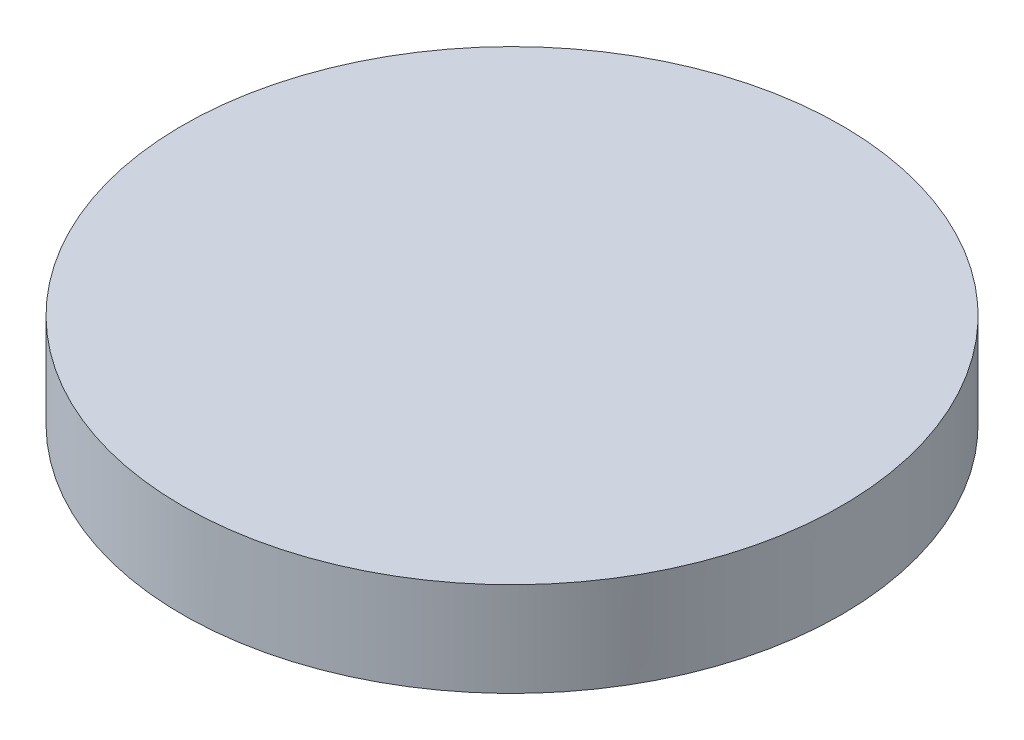
ISO-10303-21;
HEADER;
FILE_DESCRIPTION(('STEP AP214'),'2;1');
FILE_NAME('part.step','',(''),(''),'','','');
FILE_SCHEMA(('AUTOMOTIVE_DESIGN { 1 0 10303 214 1 1 1 1 }'));
ENDSEC;
DATA;
#1=APPLICATION_CONTEXT('core data for automotive mechanical design processes');
#2=APPLICATION_PROTOCOL_DEFINITION('international standard','automotive_design',2000,#1);
#3=PRODUCT_CONTEXT('',#1,'mechanical');
#4=PRODUCT('Part','Part','',(#3));
#5=PRODUCT_RELATED_PRODUCT_CATEGORY('part','',(#4));
#6=PRODUCT_DEFINITION_FORMATION('','',#4);
#7=PRODUCT_DEFINITION_CONTEXT('part definition',#1,'design');
#8=PRODUCT_DEFINITION('design','',#6,#7);
#9=PRODUCT_DEFINITION_SHAPE('','',#8);
#10=(LENGTH_UNIT() NAMED_UNIT(*) SI_UNIT(.MILLI.,.METRE.));
#11=(NAMED_UNIT(*) PLANE_ANGLE_UNIT() SI_UNIT($,.RADIAN.));
#12=(NAMED_UNIT(*) SI_UNIT($,.STERADIAN.) SOLID_ANGLE_UNIT());
#13=UNCERTAINTY_MEASURE_WITH_UNIT(LENGTH_MEASURE(1.E-05),#10,'distance_accuracy_value','');
#14=(GEOMETRIC_REPRESENTATION_CONTEXT(3) GLOBAL_UNCERTAINTY_ASSIGNED_CONTEXT((#13)) GLOBAL_UNIT_ASSIGNED_CONTEXT((#10,
#11,#12)) REPRESENTATION_CONTEXT('',''));
#15=CARTESIAN_POINT('',(0.,0.,0.));
#16=DIRECTION('',(0.,0.,1.));
#17=DIRECTION('',(1.,0.,0.));
#18=AXIS2_PLACEMENT_3D('',#15,#16,#17);
#19=CARTESIAN_POINT('',(-11.22,3.,13.02));
#20=DIRECTION('',(0.,1.,0.));
#21=DIRECTION('',(0.,0.,1.));
#22=AXIS2_PLACEMENT_3D('',#19,#20,#21);
#23=CYLINDRICAL_SURFACE('',#22,0.75);
#24=CARTESIAN_POINT('',(-11.22,3.,13.02));
#25=DIRECTION('',(0.,1.,0.));
#26=DIRECTION('',(0.,0.,1.));
#27=AXIS2_PLACEMENT_3D('',#24,#25,#26);
#28=CIRCLE('',#27,0.75);
#29=CARTESIAN_POINT('',(-11.22,3.,13.77));
#30=VERTEX_POINT('',#29);
#31=EDGE_CURVE('E11',#30,#30,#28,.T.);
#32=ORIENTED_EDGE('',*,*,#31,.T.);
#33=EDGE_LOOP('',(#32));
#34=FACE_BOUND('',#33,.T.);
#35=CARTESIAN_POINT('',(-11.22,5.,13.02));
#36=DIRECTION('',(0.,1.,0.));
#37=DIRECTION('',(0.,0.,1.));
#38=AXIS2_PLACEMENT_3D('',#35,#36,#37);
#39=CIRCLE('',#38,0.75);
#40=CARTESIAN_POINT('',(-11.22,5.,13.77));
#41=VERTEX_POINT('',#40);
#42=EDGE_CURVE('E54',#41,#41,#39,.T.);
#43=ORIENTED_EDGE('',*,*,#42,.F.);
#44=EDGE_LOOP('',(#43));
#45=FACE_BOUND('',#44,.T.);
#46=ADVANCED_FACE('F51',(#34,#45),#23,.T.);
#47=CARTESIAN_POINT('',(-11.22,3.,13.02));
#48=DIRECTION('',(0.,1.,0.));
#49=DIRECTION('',(0.,0.,1.));
#50=AXIS2_PLACEMENT_3D('',#47,#48,#49);
#51=PLANE('',#50);
#52=ORIENTED_EDGE('',*,*,#31,.F.);
#53=EDGE_LOOP('',(#52));
#54=FACE_BOUND('',#53,.T.);
#55=ADVANCED_FACE('F66',(#54),#51,.F.);
#56=CARTESIAN_POINT('',(-11.22,5.,13.02));
#57=DIRECTION('',(0.,1.,0.));
#58=DIRECTION('',(0.,0.,1.));
#59=AXIS2_PLACEMENT_3D('',#56,#57,#58);
#60=PLANE('',#59);
#61=ORIENTED_EDGE('',*,*,#42,.T.);
#62=EDGE_LOOP('',(#61));
#63=FACE_BOUND('',#62,.T.);
#64=ADVANCED_FACE('F63',(#63),#60,.T.);
#65=CLOSED_SHELL('',(#46,#55,#64));
#66=MANIFOLD_SOLID_BREP('B2',#65);
#67=CARTESIAN_POINT('',(0.,8.,0.));
#68=DIRECTION('',(0.,-1.,0.));
#69=DIRECTION('',(0.,0.,-1.));
#70=AXIS2_PLACEMENT_3D('',#67,#68,#69);
#71=CYLINDRICAL_SURFACE('',#70,28.);
#72=CARTESIAN_POINT('',(0.,8.,0.));
#73=DIRECTION('',(0.,1.,0.));
#74=DIRECTION('',(0.,0.,1.));
#75=AXIS2_PLACEMENT_3D('',#72,#73,#74);
#76=CIRCLE('',#75,28.);
#77=CARTESIAN_POINT('',(0.,8.,28.));
#78=VERTEX_POINT('',#77);
#79=EDGE_CURVE('E49',#78,#78,#76,.T.);
#80=ORIENTED_EDGE('',*,*,#79,.F.);
#81=EDGE_LOOP('',(#80));
#82=FACE_BOUND('',#81,.T.);
#83=DIRECTION('',(0.,-1.,0.));
#84=VECTOR('',#83,1.);
#85=CARTESIAN_POINT('',(-27.5316181870954,8.,-5.1));
#86=LINE('',#85,#84);
#87=CARTESIAN_POINT('',(-27.5316181870954,5.,-5.1));
#88=VERTEX_POINT('',#87);
#89=CARTESIAN_POINT('',(-27.5316181870954,0.,-5.1));
#90=VERTEX_POINT('',#89);
#91=EDGE_CURVE('E172',#88,#90,#86,.T.);
#92=ORIENTED_EDGE('',*,*,#91,.F.);
#93=CARTESIAN_POINT('',(0.,5.,0.));
#94=DIRECTION('',(0.,1.,0.));
#95=DIRECTION('',(0.,0.,1.));
#96=AXIS2_PLACEMENT_3D('',#93,#94,#95);
#97=CIRCLE('',#96,28.);
#98=CARTESIAN_POINT('',(-27.5316181870954,5.,5.1));
#99=VERTEX_POINT('',#98);
#100=EDGE_CURVE('E118',#88,#99,#97,.T.);
#101=ORIENTED_EDGE('',*,*,#100,.T.);
#102=DIRECTION('',(0.,-1.,0.));
#103=VECTOR('',#102,1.);
#104=CARTESIAN_POINT('',(-27.5316181870954,8.,5.1));
#105=LINE('',#104,#103);
#106=CARTESIAN_POINT('',(-27.5316181870954,0.,5.1));
#107=VERTEX_POINT('',#106);
#108=EDGE_CURVE('E141',#107,#99,#105,.F.);
#109=ORIENTED_EDGE('',*,*,#108,.F.);
#110=CARTESIAN_POINT('',(0.,0.,0.));
#111=DIRECTION('',(0.,1.,0.));
#112=DIRECTION('',(0.,0.,1.));
#113=AXIS2_PLACEMENT_3D('',#110,#111,#112);
#114=CIRCLE('',#113,28.);
#115=EDGE_CURVE('E101',#107,#90,#114,.T.);
#116=ORIENTED_EDGE('',*,*,#115,.T.);
#117=EDGE_LOOP('',(#92,#101,#109,#116));
#118=FACE_BOUND('',#117,.T.);
#119=ADVANCED_FACE('F98',(#82,#118),#71,.T.);
#120=CARTESIAN_POINT('',(0.,0.,0.));
#121=DIRECTION('',(0.,1.,0.));
#122=DIRECTION('',(0.,0.,1.));
#123=AXIS2_PLACEMENT_3D('',#120,#121,#122);
#124=PLANE('',#123);
#125=DIRECTION('',(-1.,0.,0.));
#126=VECTOR('',#125,1.);
#127=CARTESIAN_POINT('',(-142.526664036245,0.,-5.1));
#128=LINE('',#127,#126);
#129=CARTESIAN_POINT('',(-26.0046149750386,0.,-5.1));
#130=VERTEX_POINT('',#129);
#131=EDGE_CURVE('E149',#130,#90,#128,.T.);
#132=ORIENTED_EDGE('',*,*,#131,.T.);
#133=ORIENTED_EDGE('',*,*,#115,.F.);
#134=DIRECTION('',(1.,0.,0.));
#135=VECTOR('',#134,1.);
#136=CARTESIAN_POINT('',(-142.526664036245,0.,5.1));
#137=LINE('',#136,#135);
#138=CARTESIAN_POINT('',(-26.0046149750386,0.,5.1));
#139=VERTEX_POINT('',#138);
#140=EDGE_CURVE('E138',#107,#139,#137,.T.);
#141=ORIENTED_EDGE('',*,*,#140,.T.);
#142=CARTESIAN_POINT('',(0.,0.,0.));
#143=DIRECTION('',(0.,1.,0.));
#144=DIRECTION('',(0.,0.,1.));
#145=AXIS2_PLACEMENT_3D('',#142,#143,#144);
#146=CIRCLE('',#145,26.5);
#147=EDGE_CURVE('E163',#139,#130,#146,.T.);
#148=ORIENTED_EDGE('',*,*,#147,.T.);
#149=EDGE_LOOP('',(#132,#133,#141,#148));
#150=FACE_BOUND('',#149,.T.);
#151=ADVANCED_FACE('F158',(#150),#124,.F.);
#152=CARTESIAN_POINT('',(0.,5.,0.));
#153=DIRECTION('',(0.,-1.,0.));
#154=DIRECTION('',(0.,0.,-1.));
#155=AXIS2_PLACEMENT_3D('',#152,#153,#154);
#156=CYLINDRICAL_SURFACE('',#155,26.5);
#157=CARTESIAN_POINT('',(0.,5.,0.));
#158=DIRECTION('',(0.,1.,0.));
#159=DIRECTION('',(0.,0.,1.));
#160=AXIS2_PLACEMENT_3D('',#157,#158,#159);
#161=CIRCLE('',#160,26.5);
#162=CARTESIAN_POINT('',(-26.0046149750386,5.,5.1));
#163=VERTEX_POINT('',#162);
#164=CARTESIAN_POINT('',(-26.0046149750386,5.,-5.1));
#165=VERTEX_POINT('',#164);
#166=EDGE_CURVE('E160',#163,#165,#161,.T.);
#167=ORIENTED_EDGE('',*,*,#166,.T.);
#168=DIRECTION('',(0.,-1.,0.));
#169=VECTOR('',#168,1.);
#170=CARTESIAN_POINT('',(-26.0046149750386,5.,-5.1));
#171=LINE('',#170,#169);
#172=EDGE_CURVE('E155',#165,#130,#171,.T.);
#173=ORIENTED_EDGE('',*,*,#172,.T.);
#174=ORIENTED_EDGE('',*,*,#147,.F.);
#175=DIRECTION('',(0.,-1.,0.));
#176=VECTOR('',#175,1.);
#177=CARTESIAN_POINT('',(-26.0046149750386,5.,5.1));
#178=LINE('',#177,#176);
#179=EDGE_CURVE('E143',#139,#163,#178,.F.);
#180=ORIENTED_EDGE('',*,*,#179,.T.);
#181=EDGE_LOOP('',(#167,#173,#174,#180));
#182=FACE_BOUND('',#181,.T.);
#183=ADVANCED_FACE('F187',(#182),#156,.F.);
#184=CARTESIAN_POINT('',(0.,8.,0.));
#185=DIRECTION('',(0.,1.,0.));
#186=DIRECTION('',(0.,0.,1.));
#187=AXIS2_PLACEMENT_3D('',#184,#185,#186);
#188=PLANE('',#187);
#189=ORIENTED_EDGE('',*,*,#79,.T.);
#190=EDGE_LOOP('',(#189));
#191=FACE_BOUND('',#190,.T.);
#192=ADVANCED_FACE('F190',(#191),#188,.T.);
#193=CARTESIAN_POINT('',(0.,5.,0.));
#194=DIRECTION('',(0.,1.,0.));
#195=DIRECTION('',(0.,0.,1.));
#196=AXIS2_PLACEMENT_3D('',#193,#194,#195);
#197=PLANE('',#196);
#198=ORIENTED_EDGE('',*,*,#166,.F.);
#199=DIRECTION('',(1.,0.,0.));
#200=VECTOR('',#199,1.);
#201=CARTESIAN_POINT('',(-142.526664036245,5.,5.1));
#202=LINE('',#201,#200);
#203=EDGE_CURVE('E178',#99,#163,#202,.T.);
#204=ORIENTED_EDGE('',*,*,#203,.F.);
#205=ORIENTED_EDGE('',*,*,#100,.F.);
#206=DIRECTION('',(-1.,0.,0.));
#207=VECTOR('',#206,1.);
#208=CARTESIAN_POINT('',(-142.526664036245,5.,-5.1));
#209=LINE('',#208,#207);
#210=EDGE_CURVE('E113',#165,#88,#209,.T.);
#211=ORIENTED_EDGE('',*,*,#210,.F.);
#212=EDGE_LOOP('',(#198,#204,#205,#211));
#213=FACE_BOUND('',#212,.T.);
#214=ADVANCED_FACE('F188',(#213),#197,.F.);
#215=CARTESIAN_POINT('',(-142.526664036245,5.,-5.1));
#216=DIRECTION('',(0.,0.,1.));
#217=DIRECTION('',(1.,0.,0.));
#218=AXIS2_PLACEMENT_3D('',#215,#216,#217);
#219=PLANE('',#218);
#220=ORIENTED_EDGE('',*,*,#91,.T.);
#221=ORIENTED_EDGE('',*,*,#131,.F.);
#222=ORIENTED_EDGE('',*,*,#172,.F.);
#223=ORIENTED_EDGE('',*,*,#210,.T.);
#224=EDGE_LOOP('',(#220,#221,#222,#223));
#225=FACE_BOUND('',#224,.T.);
#226=ADVANCED_FACE('F186',(#225),#219,.T.);
#227=CARTESIAN_POINT('',(-142.526664036245,5.,5.1));
#228=DIRECTION('',(0.,0.,-1.));
#229=DIRECTION('',(-1.,0.,0.));
#230=AXIS2_PLACEMENT_3D('',#227,#228,#229);
#231=PLANE('',#230);
#232=ORIENTED_EDGE('',*,*,#108,.T.);
#233=ORIENTED_EDGE('',*,*,#203,.T.);
#234=ORIENTED_EDGE('',*,*,#179,.F.);
#235=ORIENTED_EDGE('',*,*,#140,.F.);
#236=EDGE_LOOP('',(#232,#233,#234,#235));
#237=FACE_BOUND('',#236,.T.);
#238=ADVANCED_FACE('F140',(#237),#231,.T.);
#239=CLOSED_SHELL('',(#119,#151,#183,#192,#214,#226,#238));
#240=MANIFOLD_SOLID_BREP('B6',#239);
#241=ADVANCED_BREP_SHAPE_REPRESENTATION('',(#18,#66,#240),#14);
#242=SHAPE_DEFINITION_REPRESENTATION(#9,#241);
ENDSEC;
END-ISO-10303-21;
